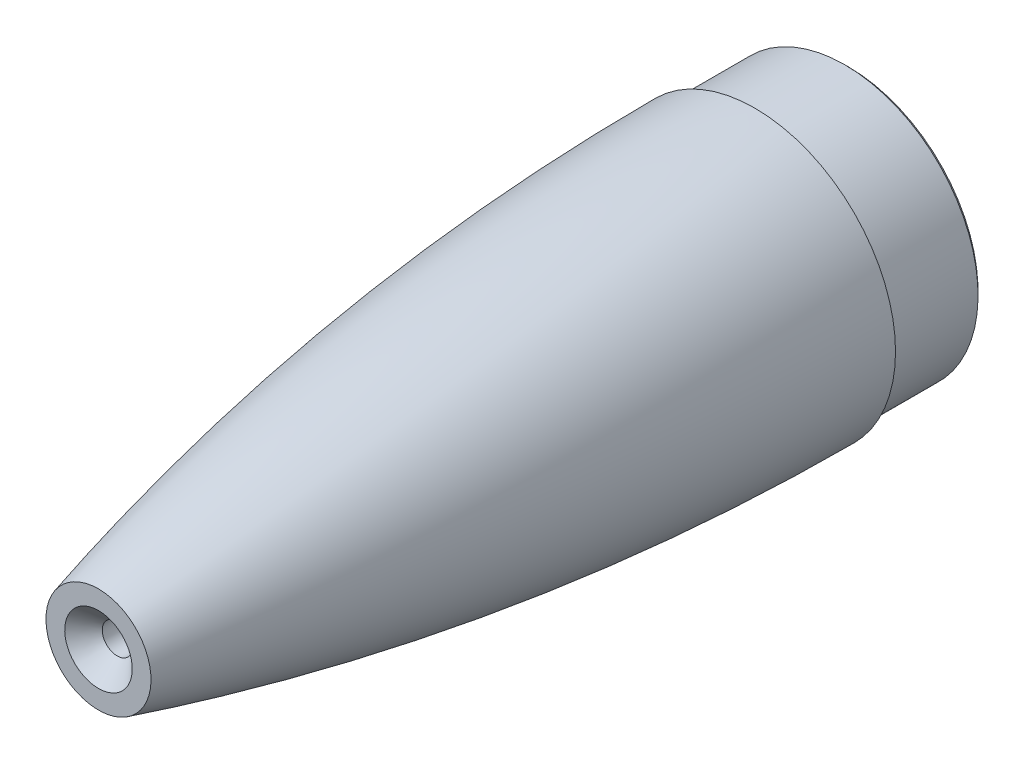
ISO-10303-21;
HEADER;
FILE_DESCRIPTION(('STEP AP214'),'2;1');
FILE_NAME('part.step','',(''),(''),'','','');
FILE_SCHEMA(('AUTOMOTIVE_DESIGN { 1 0 10303 214 1 1 1 1 }'));
ENDSEC;
DATA;
#1=APPLICATION_CONTEXT('core data for automotive mechanical design processes');
#2=APPLICATION_PROTOCOL_DEFINITION('international standard','automotive_design',2000,#1);
#3=PRODUCT_CONTEXT('',#1,'mechanical');
#4=PRODUCT('Part','Part','',(#3));
#5=PRODUCT_RELATED_PRODUCT_CATEGORY('part','',(#4));
#6=PRODUCT_DEFINITION_FORMATION('','',#4);
#7=PRODUCT_DEFINITION_CONTEXT('part definition',#1,'design');
#8=PRODUCT_DEFINITION('design','',#6,#7);
#9=PRODUCT_DEFINITION_SHAPE('','',#8);
#10=(LENGTH_UNIT() NAMED_UNIT(*) SI_UNIT(.MILLI.,.METRE.));
#11=(NAMED_UNIT(*) PLANE_ANGLE_UNIT() SI_UNIT($,.RADIAN.));
#12=(NAMED_UNIT(*) SI_UNIT($,.STERADIAN.) SOLID_ANGLE_UNIT());
#13=UNCERTAINTY_MEASURE_WITH_UNIT(LENGTH_MEASURE(1.E-05),#10,'distance_accuracy_value','');
#14=(GEOMETRIC_REPRESENTATION_CONTEXT(3) GLOBAL_UNCERTAINTY_ASSIGNED_CONTEXT((#13)) GLOBAL_UNIT_ASSIGNED_CONTEXT((#10,
#11,#12)) REPRESENTATION_CONTEXT('',''));
#15=CARTESIAN_POINT('',(0.,0.,0.));
#16=DIRECTION('',(0.,0.,1.));
#17=DIRECTION('',(1.,0.,0.));
#18=AXIS2_PLACEMENT_3D('',#15,#16,#17);
#19=CARTESIAN_POINT('',(0.,0.,0.));
#20=DIRECTION('',(0.,0.,-1.));
#21=DIRECTION('',(0.,1.,0.));
#22=AXIS2_PLACEMENT_3D('',#19,#20,#21);
#23=DEGENERATE_TOROIDAL_SURFACE('',#22,625.845744680851,663.345744680851,.F.);
#24=CARTESIAN_POINT('',(0.,0.,175.));
#25=DIRECTION('',(0.,0.,-1.));
#26=DIRECTION('',(0.,1.,0.));
#27=AXIS2_PLACEMENT_3D('',#24,#25,#26);
#28=CIRCLE('',#27,14.);
#29=CARTESIAN_POINT('',(0.,14.,175.));
#30=VERTEX_POINT('',#29);
#31=EDGE_CURVE('E10',#30,#30,#28,.T.);
#32=ORIENTED_EDGE('',*,*,#31,.T.);
#33=EDGE_LOOP('',(#32));
#34=FACE_BOUND('',#33,.T.);
#35=CARTESIAN_POINT('',(0.,0.,0.));
#36=DIRECTION('',(0.,0.,-1.));
#37=DIRECTION('',(0.,1.,0.));
#38=AXIS2_PLACEMENT_3D('',#35,#36,#37);
#39=CIRCLE('',#38,37.5);
#40=CARTESIAN_POINT('',(0.,37.5,0.));
#41=VERTEX_POINT('',#40);
#42=EDGE_CURVE('E69',#41,#41,#39,.T.);
#43=ORIENTED_EDGE('',*,*,#42,.F.);
#44=EDGE_LOOP('',(#43));
#45=FACE_BOUND('',#44,.T.);
#46=ADVANCED_FACE('F29',(#34,#45),#23,.F.);
#47=CARTESIAN_POINT('',(0.,14.,175.));
#48=DIRECTION('',(0.,0.,1.));
#49=DIRECTION('',(0.,-1.,0.));
#50=AXIS2_PLACEMENT_3D('',#47,#48,#49);
#51=PLANE('',#50);
#52=CARTESIAN_POINT('',(0.,0.,175.));
#53=DIRECTION('',(0.,0.,-1.));
#54=DIRECTION('',(0.,1.,0.));
#55=AXIS2_PLACEMENT_3D('',#52,#53,#54);
#56=CIRCLE('',#55,8.99999999999998);
#57=CARTESIAN_POINT('',(0.,8.99999999999998,175.));
#58=VERTEX_POINT('',#57);
#59=EDGE_CURVE('E35',#58,#58,#56,.T.);
#60=ORIENTED_EDGE('',*,*,#59,.T.);
#61=EDGE_LOOP('',(#60));
#62=FACE_BOUND('',#61,.T.);
#63=ORIENTED_EDGE('',*,*,#31,.F.);
#64=EDGE_LOOP('',(#63));
#65=FACE_BOUND('',#64,.T.);
#66=ADVANCED_FACE('F77',(#62,#65),#51,.T.);
#67=CARTESIAN_POINT('',(0.,0.,175.));
#68=DIRECTION('',(0.,0.,1.));
#69=DIRECTION('',(0.,-1.,0.));
#70=AXIS2_PLACEMENT_3D('',#67,#68,#69);
#71=CONICAL_SURFACE('',#70,8.99999999999998,0.785398163397445);
#72=CARTESIAN_POINT('',(0.,0.,170.));
#73=DIRECTION('',(0.,0.,-1.));
#74=DIRECTION('',(0.,1.,0.));
#75=AXIS2_PLACEMENT_3D('',#72,#73,#74);
#76=CIRCLE('',#75,3.99999999999998);
#77=CARTESIAN_POINT('',(0.,3.99999999999998,170.));
#78=VERTEX_POINT('',#77);
#79=EDGE_CURVE('E39',#78,#78,#76,.T.);
#80=ORIENTED_EDGE('',*,*,#79,.T.);
#81=EDGE_LOOP('',(#80));
#82=FACE_BOUND('',#81,.T.);
#83=ORIENTED_EDGE('',*,*,#59,.F.);
#84=EDGE_LOOP('',(#83));
#85=FACE_BOUND('',#84,.T.);
#86=ADVANCED_FACE('F81',(#82,#85),#71,.F.);
#87=CARTESIAN_POINT('',(0.,0.,0.));
#88=DIRECTION('',(0.,0.,-1.));
#89=DIRECTION('',(0.,1.,0.));
#90=AXIS2_PLACEMENT_3D('',#87,#88,#89);
#91=CYLINDRICAL_SURFACE('',#90,3.99999999999998);
#92=CARTESIAN_POINT('',(0.,0.,120.));
#93=DIRECTION('',(0.,0.,-1.));
#94=DIRECTION('',(0.,1.,0.));
#95=AXIS2_PLACEMENT_3D('',#92,#93,#94);
#96=CIRCLE('',#95,3.99999999999998);
#97=CARTESIAN_POINT('',(0.,3.99999999999998,120.));
#98=VERTEX_POINT('',#97);
#99=EDGE_CURVE('E43',#98,#98,#96,.T.);
#100=ORIENTED_EDGE('',*,*,#99,.T.);
#101=EDGE_LOOP('',(#100));
#102=FACE_BOUND('',#101,.T.);
#103=ORIENTED_EDGE('',*,*,#79,.F.);
#104=EDGE_LOOP('',(#103));
#105=FACE_BOUND('',#104,.T.);
#106=ADVANCED_FACE('F85',(#102,#105),#91,.F.);
#107=CARTESIAN_POINT('',(0.,3.99999999999998,120.));
#108=DIRECTION('',(0.,0.,-1.));
#109=DIRECTION('',(0.,1.,0.));
#110=AXIS2_PLACEMENT_3D('',#107,#108,#109);
#111=PLANE('',#110);
#112=CARTESIAN_POINT('',(0.,0.,120.));
#113=DIRECTION('',(0.,0.,-1.));
#114=DIRECTION('',(0.,1.,0.));
#115=AXIS2_PLACEMENT_3D('',#112,#113,#114);
#116=CIRCLE('',#115,20.);
#117=CARTESIAN_POINT('',(0.,20.,120.));
#118=VERTEX_POINT('',#117);
#119=EDGE_CURVE('E48',#118,#118,#116,.T.);
#120=ORIENTED_EDGE('',*,*,#119,.T.);
#121=EDGE_LOOP('',(#120));
#122=FACE_BOUND('',#121,.T.);
#123=ORIENTED_EDGE('',*,*,#99,.F.);
#124=EDGE_LOOP('',(#123));
#125=FACE_BOUND('',#124,.T.);
#126=ADVANCED_FACE('F92',(#122,#125),#111,.T.);
#127=CARTESIAN_POINT('',(0.,0.,0.));
#128=DIRECTION('',(0.,0.,-1.));
#129=DIRECTION('',(0.,1.,0.));
#130=AXIS2_PLACEMENT_3D('',#127,#128,#129);
#131=CYLINDRICAL_SURFACE('',#130,20.);
#132=CARTESIAN_POINT('',(0.,0.,60.));
#133=DIRECTION('',(0.,0.,-1.));
#134=DIRECTION('',(0.,1.,0.));
#135=AXIS2_PLACEMENT_3D('',#132,#133,#134);
#136=CIRCLE('',#135,20.);
#137=CARTESIAN_POINT('',(0.,20.,60.));
#138=VERTEX_POINT('',#137);
#139=EDGE_CURVE('E51',#138,#138,#136,.T.);
#140=ORIENTED_EDGE('',*,*,#139,.T.);
#141=EDGE_LOOP('',(#140));
#142=FACE_BOUND('',#141,.T.);
#143=ORIENTED_EDGE('',*,*,#119,.F.);
#144=EDGE_LOOP('',(#143));
#145=FACE_BOUND('',#144,.T.);
#146=ADVANCED_FACE('F96',(#142,#145),#131,.F.);
#147=CARTESIAN_POINT('',(0.,20.,60.));
#148=DIRECTION('',(0.,0.,-1.));
#149=DIRECTION('',(0.,1.,0.));
#150=AXIS2_PLACEMENT_3D('',#147,#148,#149);
#151=PLANE('',#150);
#152=CARTESIAN_POINT('',(0.,0.,60.));
#153=DIRECTION('',(0.,0.,-1.));
#154=DIRECTION('',(0.,1.,0.));
#155=AXIS2_PLACEMENT_3D('',#152,#153,#154);
#156=CIRCLE('',#155,29.5);
#157=CARTESIAN_POINT('',(0.,29.5,60.));
#158=VERTEX_POINT('',#157);
#159=EDGE_CURVE('E54',#158,#158,#156,.T.);
#160=ORIENTED_EDGE('',*,*,#159,.T.);
#161=EDGE_LOOP('',(#160));
#162=FACE_BOUND('',#161,.T.);
#163=ORIENTED_EDGE('',*,*,#139,.F.);
#164=EDGE_LOOP('',(#163));
#165=FACE_BOUND('',#164,.T.);
#166=ADVANCED_FACE('F100',(#162,#165),#151,.T.);
#167=CARTESIAN_POINT('',(0.,0.,0.));
#168=DIRECTION('',(0.,0.,-1.));
#169=DIRECTION('',(0.,1.,0.));
#170=AXIS2_PLACEMENT_3D('',#167,#168,#169);
#171=CYLINDRICAL_SURFACE('',#170,29.5);
#172=CARTESIAN_POINT('',(0.,0.,-25.));
#173=DIRECTION('',(0.,0.,-1.));
#174=DIRECTION('',(0.,1.,0.));
#175=AXIS2_PLACEMENT_3D('',#172,#173,#174);
#176=CIRCLE('',#175,29.5);
#177=CARTESIAN_POINT('',(0.,29.5,-25.));
#178=VERTEX_POINT('',#177);
#179=EDGE_CURVE('E57',#178,#178,#176,.T.);
#180=ORIENTED_EDGE('',*,*,#179,.T.);
#181=EDGE_LOOP('',(#180));
#182=FACE_BOUND('',#181,.T.);
#183=ORIENTED_EDGE('',*,*,#159,.F.);
#184=EDGE_LOOP('',(#183));
#185=FACE_BOUND('',#184,.T.);
#186=ADVANCED_FACE('F104',(#182,#185),#171,.F.);
#187=CARTESIAN_POINT('',(0.,34.5,-25.));
#188=DIRECTION('',(0.,0.,-1.));
#189=DIRECTION('',(0.,1.,0.));
#190=AXIS2_PLACEMENT_3D('',#187,#188,#189);
#191=PLANE('',#190);
#192=CARTESIAN_POINT('',(0.,0.,-25.));
#193=DIRECTION('',(0.,0.,-1.));
#194=DIRECTION('',(0.,1.,0.));
#195=AXIS2_PLACEMENT_3D('',#192,#193,#194);
#196=CIRCLE('',#195,34.5);
#197=CARTESIAN_POINT('',(0.,34.5,-25.));
#198=VERTEX_POINT('',#197);
#199=EDGE_CURVE('E60',#198,#198,#196,.T.);
#200=ORIENTED_EDGE('',*,*,#199,.T.);
#201=EDGE_LOOP('',(#200));
#202=FACE_BOUND('',#201,.T.);
#203=ORIENTED_EDGE('',*,*,#179,.F.);
#204=EDGE_LOOP('',(#203));
#205=FACE_BOUND('',#204,.T.);
#206=ADVANCED_FACE('F108',(#202,#205),#191,.T.);
#207=CARTESIAN_POINT('',(0.,0.,-25.));
#208=DIRECTION('',(0.,0.,1.));
#209=DIRECTION('',(0.,-1.,0.));
#210=AXIS2_PLACEMENT_3D('',#207,#208,#209);
#211=CONICAL_SURFACE('',#210,34.5,0.785398163397447);
#212=CARTESIAN_POINT('',(0.,0.,-24.));
#213=DIRECTION('',(0.,0.,-1.));
#214=DIRECTION('',(0.,1.,0.));
#215=AXIS2_PLACEMENT_3D('',#212,#213,#214);
#216=CIRCLE('',#215,35.5);
#217=CARTESIAN_POINT('',(0.,35.5,-24.));
#218=VERTEX_POINT('',#217);
#219=EDGE_CURVE('E63',#218,#218,#216,.T.);
#220=ORIENTED_EDGE('',*,*,#219,.T.);
#221=EDGE_LOOP('',(#220));
#222=FACE_BOUND('',#221,.T.);
#223=ORIENTED_EDGE('',*,*,#199,.F.);
#224=EDGE_LOOP('',(#223));
#225=FACE_BOUND('',#224,.T.);
#226=ADVANCED_FACE('F112',(#222,#225),#211,.T.);
#227=CARTESIAN_POINT('',(0.,0.,0.));
#228=DIRECTION('',(0.,0.,-1.));
#229=DIRECTION('',(0.,1.,0.));
#230=AXIS2_PLACEMENT_3D('',#227,#228,#229);
#231=CYLINDRICAL_SURFACE('',#230,35.5);
#232=CARTESIAN_POINT('',(0.,0.,0.));
#233=DIRECTION('',(0.,0.,-1.));
#234=DIRECTION('',(0.,1.,0.));
#235=AXIS2_PLACEMENT_3D('',#232,#233,#234);
#236=CIRCLE('',#235,35.5);
#237=CARTESIAN_POINT('',(0.,35.5,0.));
#238=VERTEX_POINT('',#237);
#239=EDGE_CURVE('E66',#238,#238,#236,.T.);
#240=ORIENTED_EDGE('',*,*,#239,.T.);
#241=EDGE_LOOP('',(#240));
#242=FACE_BOUND('',#241,.T.);
#243=ORIENTED_EDGE('',*,*,#219,.F.);
#244=EDGE_LOOP('',(#243));
#245=FACE_BOUND('',#244,.T.);
#246=ADVANCED_FACE('F116',(#242,#245),#231,.T.);
#247=CARTESIAN_POINT('',(0.,37.5,0.));
#248=DIRECTION('',(0.,0.,-1.));
#249=DIRECTION('',(0.,1.,0.));
#250=AXIS2_PLACEMENT_3D('',#247,#248,#249);
#251=PLANE('',#250);
#252=ORIENTED_EDGE('',*,*,#42,.T.);
#253=EDGE_LOOP('',(#252));
#254=FACE_BOUND('',#253,.T.);
#255=ORIENTED_EDGE('',*,*,#239,.F.);
#256=EDGE_LOOP('',(#255));
#257=FACE_BOUND('',#256,.T.);
#258=ADVANCED_FACE('F73',(#254,#257),#251,.T.);
#259=CLOSED_SHELL('',(#46,#66,#86,#106,#126,#146,#166,#186,#206,#226,#246,#258));
#260=MANIFOLD_SOLID_BREP('B2',#259);
#261=ADVANCED_BREP_SHAPE_REPRESENTATION('',(#18,#260),#14);
#262=SHAPE_DEFINITION_REPRESENTATION(#9,#261);
ENDSEC;
END-ISO-10303-21;
